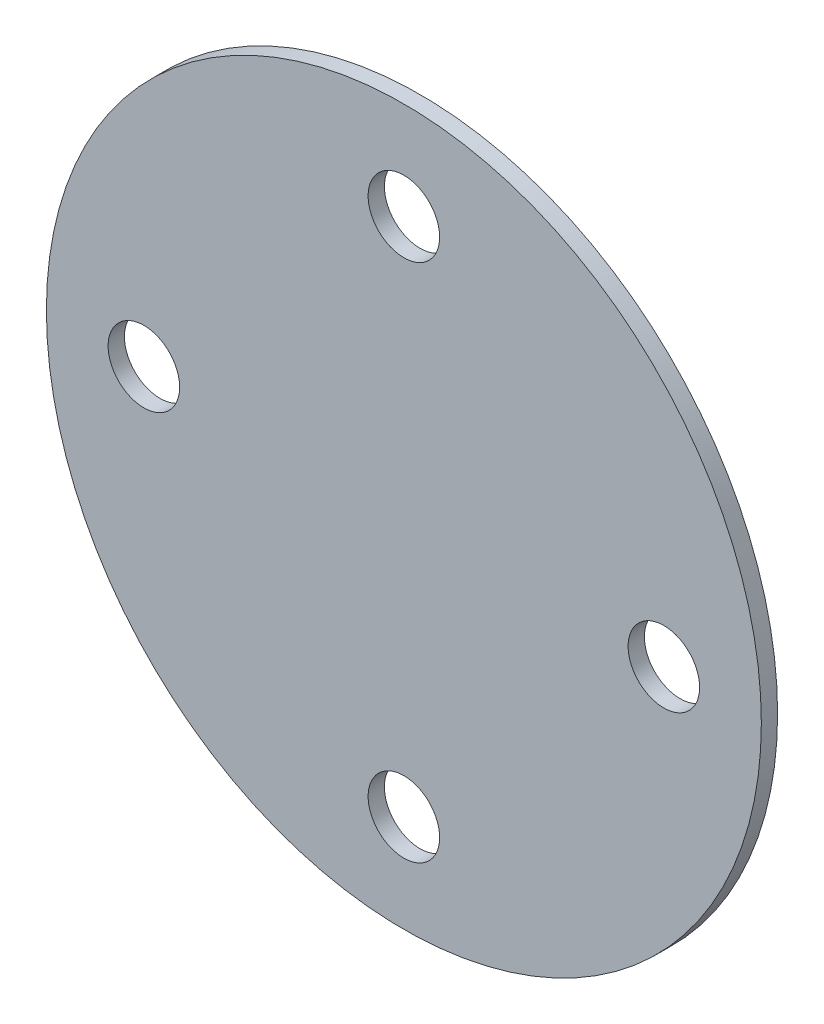
ISO-10303-21;
HEADER;
FILE_DESCRIPTION(('STEP AP214'),'2;1');
FILE_NAME('part.step','',(''),(''),'','','');
FILE_SCHEMA(('AUTOMOTIVE_DESIGN { 1 0 10303 214 1 1 1 1 }'));
ENDSEC;
DATA;
#1=APPLICATION_CONTEXT('core data for automotive mechanical design processes');
#2=APPLICATION_PROTOCOL_DEFINITION('international standard','automotive_design',2000,#1);
#3=PRODUCT_CONTEXT('',#1,'mechanical');
#4=PRODUCT('Part','Part','',(#3));
#5=PRODUCT_RELATED_PRODUCT_CATEGORY('part','',(#4));
#6=PRODUCT_DEFINITION_FORMATION('','',#4);
#7=PRODUCT_DEFINITION_CONTEXT('part definition',#1,'design');
#8=PRODUCT_DEFINITION('design','',#6,#7);
#9=PRODUCT_DEFINITION_SHAPE('','',#8);
#10=(LENGTH_UNIT() NAMED_UNIT(*) SI_UNIT(.MILLI.,.METRE.));
#11=(NAMED_UNIT(*) PLANE_ANGLE_UNIT() SI_UNIT($,.RADIAN.));
#12=(NAMED_UNIT(*) SI_UNIT($,.STERADIAN.) SOLID_ANGLE_UNIT());
#13=UNCERTAINTY_MEASURE_WITH_UNIT(LENGTH_MEASURE(1.E-05),#10,'distance_accuracy_value','');
#14=(GEOMETRIC_REPRESENTATION_CONTEXT(3) GLOBAL_UNCERTAINTY_ASSIGNED_CONTEXT((#13)) GLOBAL_UNIT_ASSIGNED_CONTEXT((#10,
#11,#12)) REPRESENTATION_CONTEXT('',''));
#15=CARTESIAN_POINT('',(0.,0.,0.));
#16=DIRECTION('',(0.,0.,1.));
#17=DIRECTION('',(1.,0.,0.));
#18=AXIS2_PLACEMENT_3D('',#15,#16,#17);
#19=CARTESIAN_POINT('',(0.,0.,0.5));
#20=DIRECTION('',(0.,0.,1.));
#21=DIRECTION('',(1.,0.,0.));
#22=AXIS2_PLACEMENT_3D('',#19,#20,#21);
#23=PLANE('',#22);
#24=CARTESIAN_POINT('',(4.52787916007828E-13,-8.,0.5));
#25=DIRECTION('',(0.,0.,1.));
#26=DIRECTION('',(1.,0.,0.));
#27=AXIS2_PLACEMENT_3D('',#24,#25,#26);
#28=CIRCLE('',#27,1.10000000000049);
#29=CARTESIAN_POINT('',(1.10000000000094,-8.,0.5));
#30=VERTEX_POINT('',#29);
#31=EDGE_CURVE('E57',#30,#30,#28,.T.);
#32=ORIENTED_EDGE('',*,*,#31,.F.);
#33=EDGE_LOOP('',(#32));
#34=FACE_BOUND('',#33,.T.);
#35=CARTESIAN_POINT('',(0.,8.,0.5));
#36=DIRECTION('',(0.,0.,1.));
#37=DIRECTION('',(1.,0.,0.));
#38=AXIS2_PLACEMENT_3D('',#35,#36,#37);
#39=CIRCLE('',#38,1.1);
#40=CARTESIAN_POINT('',(1.1,8.,0.5));
#41=VERTEX_POINT('',#40);
#42=EDGE_CURVE('E46',#41,#41,#39,.T.);
#43=ORIENTED_EDGE('',*,*,#42,.F.);
#44=EDGE_LOOP('',(#43));
#45=FACE_BOUND('',#44,.T.);
#46=CARTESIAN_POINT('',(0.,0.,0.5));
#47=DIRECTION('',(0.,0.,1.));
#48=DIRECTION('',(1.,0.,0.));
#49=AXIS2_PLACEMENT_3D('',#46,#47,#48);
#50=CIRCLE('',#49,11.);
#51=CARTESIAN_POINT('',(11.,0.,0.5));
#52=VERTEX_POINT('',#51);
#53=EDGE_CURVE('E10',#52,#52,#50,.T.);
#54=ORIENTED_EDGE('',*,*,#53,.T.);
#55=EDGE_LOOP('',(#54));
#56=FACE_BOUND('',#55,.T.);
#57=CARTESIAN_POINT('',(8.00000000000023,2.26393958003914E-13,0.5));
#58=DIRECTION('',(0.,0.,1.));
#59=DIRECTION('',(1.,0.,0.));
#60=AXIS2_PLACEMENT_3D('',#57,#58,#59);
#61=CIRCLE('',#60,1.10000000000018);
#62=CARTESIAN_POINT('',(9.1000000000004,2.26393958003914E-13,0.5));
#63=VERTEX_POINT('',#62);
#64=EDGE_CURVE('E51',#63,#63,#61,.T.);
#65=ORIENTED_EDGE('',*,*,#64,.F.);
#66=EDGE_LOOP('',(#65));
#67=FACE_BOUND('',#66,.T.);
#68=CARTESIAN_POINT('',(-7.99999999999977,-2.27373675443232E-13,0.5));
#69=DIRECTION('',(0.,0.,1.));
#70=DIRECTION('',(1.,0.,0.));
#71=AXIS2_PLACEMENT_3D('',#68,#69,#70);
#72=CIRCLE('',#71,1.10000000000036);
#73=CARTESIAN_POINT('',(-6.89999999999941,-2.27373675443232E-13,0.5));
#74=VERTEX_POINT('',#73);
#75=EDGE_CURVE('E63',#74,#74,#72,.T.);
#76=ORIENTED_EDGE('',*,*,#75,.F.);
#77=EDGE_LOOP('',(#76));
#78=FACE_BOUND('',#77,.T.);
#79=ADVANCED_FACE('F35',(#34,#45,#56,#67,#78),#23,.T.);
#80=CARTESIAN_POINT('',(0.,0.,0.));
#81=DIRECTION('',(0.,0.,1.));
#82=DIRECTION('',(1.,0.,0.));
#83=AXIS2_PLACEMENT_3D('',#80,#81,#82);
#84=PLANE('',#83);
#85=CARTESIAN_POINT('',(4.52787916007828E-13,-8.,0.));
#86=DIRECTION('',(0.,0.,1.));
#87=DIRECTION('',(1.,0.,0.));
#88=AXIS2_PLACEMENT_3D('',#85,#86,#87);
#89=CIRCLE('',#88,1.10000000000049);
#90=CARTESIAN_POINT('',(1.10000000000094,-8.,0.));
#91=VERTEX_POINT('',#90);
#92=EDGE_CURVE('E60',#91,#91,#89,.T.);
#93=ORIENTED_EDGE('',*,*,#92,.T.);
#94=EDGE_LOOP('',(#93));
#95=FACE_BOUND('',#94,.T.);
#96=CARTESIAN_POINT('',(0.,8.,0.));
#97=DIRECTION('',(0.,0.,1.));
#98=DIRECTION('',(1.,0.,0.));
#99=AXIS2_PLACEMENT_3D('',#96,#97,#98);
#100=CIRCLE('',#99,1.1);
#101=CARTESIAN_POINT('',(1.1,8.,0.));
#102=VERTEX_POINT('',#101);
#103=EDGE_CURVE('E48',#102,#102,#100,.T.);
#104=ORIENTED_EDGE('',*,*,#103,.T.);
#105=EDGE_LOOP('',(#104));
#106=FACE_BOUND('',#105,.T.);
#107=CARTESIAN_POINT('',(0.,0.,0.));
#108=DIRECTION('',(0.,0.,1.));
#109=DIRECTION('',(1.,0.,0.));
#110=AXIS2_PLACEMENT_3D('',#107,#108,#109);
#111=CIRCLE('',#110,11.);
#112=CARTESIAN_POINT('',(11.,0.,0.));
#113=VERTEX_POINT('',#112);
#114=EDGE_CURVE('E39',#113,#113,#111,.T.);
#115=ORIENTED_EDGE('',*,*,#114,.F.);
#116=EDGE_LOOP('',(#115));
#117=FACE_BOUND('',#116,.T.);
#118=CARTESIAN_POINT('',(8.00000000000023,2.26393958003914E-13,0.));
#119=DIRECTION('',(0.,0.,1.));
#120=DIRECTION('',(1.,0.,0.));
#121=AXIS2_PLACEMENT_3D('',#118,#119,#120);
#122=CIRCLE('',#121,1.10000000000018);
#123=CARTESIAN_POINT('',(9.1000000000004,2.26393958003914E-13,0.));
#124=VERTEX_POINT('',#123);
#125=EDGE_CURVE('E54',#124,#124,#122,.T.);
#126=ORIENTED_EDGE('',*,*,#125,.T.);
#127=EDGE_LOOP('',(#126));
#128=FACE_BOUND('',#127,.T.);
#129=CARTESIAN_POINT('',(-7.99999999999977,-2.27373675443232E-13,0.));
#130=DIRECTION('',(0.,0.,1.));
#131=DIRECTION('',(1.,0.,0.));
#132=AXIS2_PLACEMENT_3D('',#129,#130,#131);
#133=CIRCLE('',#132,1.10000000000036);
#134=CARTESIAN_POINT('',(-6.89999999999941,-2.27373675443232E-13,0.));
#135=VERTEX_POINT('',#134);
#136=EDGE_CURVE('E66',#135,#135,#133,.T.);
#137=ORIENTED_EDGE('',*,*,#136,.T.);
#138=EDGE_LOOP('',(#137));
#139=FACE_BOUND('',#138,.T.);
#140=ADVANCED_FACE('F76',(#95,#106,#117,#128,#139),#84,.F.);
#141=CARTESIAN_POINT('',(0.,0.,0.5));
#142=DIRECTION('',(0.,0.,-1.));
#143=DIRECTION('',(-1.,0.,0.));
#144=AXIS2_PLACEMENT_3D('',#141,#142,#143);
#145=CYLINDRICAL_SURFACE('',#144,11.);
#146=ORIENTED_EDGE('',*,*,#53,.F.);
#147=EDGE_LOOP('',(#146));
#148=FACE_BOUND('',#147,.T.);
#149=ORIENTED_EDGE('',*,*,#114,.T.);
#150=EDGE_LOOP('',(#149));
#151=FACE_BOUND('',#150,.T.);
#152=ADVANCED_FACE('F37',(#148,#151),#145,.T.);
#153=CARTESIAN_POINT('',(0.,8.,0.5));
#154=DIRECTION('',(0.,0.,-1.));
#155=DIRECTION('',(-1.,0.,0.));
#156=AXIS2_PLACEMENT_3D('',#153,#154,#155);
#157=CYLINDRICAL_SURFACE('',#156,1.1);
#158=ORIENTED_EDGE('',*,*,#42,.T.);
#159=EDGE_LOOP('',(#158));
#160=FACE_BOUND('',#159,.T.);
#161=ORIENTED_EDGE('',*,*,#103,.F.);
#162=EDGE_LOOP('',(#161));
#163=FACE_BOUND('',#162,.T.);
#164=ADVANCED_FACE('F86',(#160,#163),#157,.F.);
#165=CARTESIAN_POINT('',(8.00000000000023,2.26393958003914E-13,0.5));
#166=DIRECTION('',(0.,0.,-1.));
#167=DIRECTION('',(-1.,0.,0.));
#168=AXIS2_PLACEMENT_3D('',#165,#166,#167);
#169=CYLINDRICAL_SURFACE('',#168,1.10000000000018);
#170=ORIENTED_EDGE('',*,*,#64,.T.);
#171=EDGE_LOOP('',(#170));
#172=FACE_BOUND('',#171,.T.);
#173=ORIENTED_EDGE('',*,*,#125,.F.);
#174=EDGE_LOOP('',(#173));
#175=FACE_BOUND('',#174,.T.);
#176=ADVANCED_FACE('F89',(#172,#175),#169,.F.);
#177=CARTESIAN_POINT('',(4.52787916007828E-13,-8.,0.5));
#178=DIRECTION('',(0.,0.,-1.));
#179=DIRECTION('',(-1.,0.,0.));
#180=AXIS2_PLACEMENT_3D('',#177,#178,#179);
#181=CYLINDRICAL_SURFACE('',#180,1.10000000000049);
#182=ORIENTED_EDGE('',*,*,#31,.T.);
#183=EDGE_LOOP('',(#182));
#184=FACE_BOUND('',#183,.T.);
#185=ORIENTED_EDGE('',*,*,#92,.F.);
#186=EDGE_LOOP('',(#185));
#187=FACE_BOUND('',#186,.T.);
#188=ADVANCED_FACE('F93',(#184,#187),#181,.F.);
#189=CARTESIAN_POINT('',(-7.99999999999977,-2.27373675443232E-13,0.5));
#190=DIRECTION('',(0.,0.,-1.));
#191=DIRECTION('',(-1.,0.,0.));
#192=AXIS2_PLACEMENT_3D('',#189,#190,#191);
#193=CYLINDRICAL_SURFACE('',#192,1.10000000000036);
#194=ORIENTED_EDGE('',*,*,#75,.T.);
#195=EDGE_LOOP('',(#194));
#196=FACE_BOUND('',#195,.T.);
#197=ORIENTED_EDGE('',*,*,#136,.F.);
#198=EDGE_LOOP('',(#197));
#199=FACE_BOUND('',#198,.T.);
#200=ADVANCED_FACE('F72',(#196,#199),#193,.F.);
#201=CLOSED_SHELL('',(#79,#140,#152,#164,#176,#188,#200));
#202=MANIFOLD_SOLID_BREP('B2',#201);
#203=ADVANCED_BREP_SHAPE_REPRESENTATION('',(#18,#202),#14);
#204=SHAPE_DEFINITION_REPRESENTATION(#9,#203);
ENDSEC;
END-ISO-10303-21;
